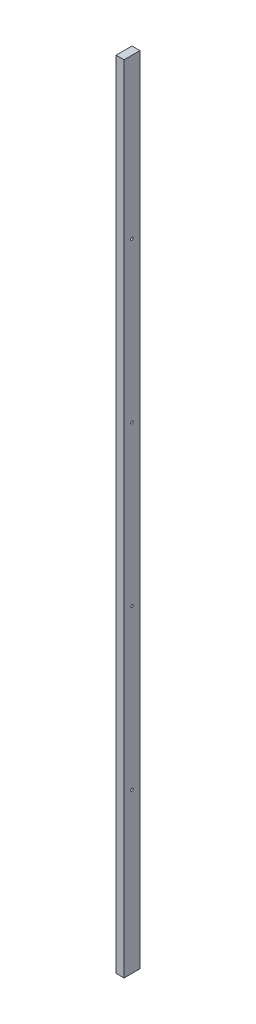
ISO-10303-21;
HEADER;
FILE_DESCRIPTION(('STEP AP214'),'2;1');
FILE_NAME('part.step','',(''),(''),'','','');
FILE_SCHEMA(('AUTOMOTIVE_DESIGN { 1 0 10303 214 1 1 1 1 }'));
ENDSEC;
DATA;
#1=APPLICATION_CONTEXT('core data for automotive mechanical design processes');
#2=APPLICATION_PROTOCOL_DEFINITION('international standard','automotive_design',2000,#1);
#3=PRODUCT_CONTEXT('',#1,'mechanical');
#4=PRODUCT('Part','Part','',(#3));
#5=PRODUCT_RELATED_PRODUCT_CATEGORY('part','',(#4));
#6=PRODUCT_DEFINITION_FORMATION('','',#4);
#7=PRODUCT_DEFINITION_CONTEXT('part definition',#1,'design');
#8=PRODUCT_DEFINITION('design','',#6,#7);
#9=PRODUCT_DEFINITION_SHAPE('','',#8);
#10=(LENGTH_UNIT() NAMED_UNIT(*) SI_UNIT(.MILLI.,.METRE.));
#11=(NAMED_UNIT(*) PLANE_ANGLE_UNIT() SI_UNIT($,.RADIAN.));
#12=(NAMED_UNIT(*) SI_UNIT($,.STERADIAN.) SOLID_ANGLE_UNIT());
#13=UNCERTAINTY_MEASURE_WITH_UNIT(LENGTH_MEASURE(1.E-05),#10,'distance_accuracy_value','');
#14=(GEOMETRIC_REPRESENTATION_CONTEXT(3) GLOBAL_UNCERTAINTY_ASSIGNED_CONTEXT((#13)) GLOBAL_UNIT_ASSIGNED_CONTEXT((#10,
#11,#12)) REPRESENTATION_CONTEXT('',''));
#15=CARTESIAN_POINT('',(0.,0.,0.));
#16=DIRECTION('',(0.,0.,1.));
#17=DIRECTION('',(1.,0.,0.));
#18=AXIS2_PLACEMENT_3D('',#15,#16,#17);
#19=CARTESIAN_POINT('',(-12.5,2500.,-25.));
#20=DIRECTION('',(1.,0.,0.));
#21=DIRECTION('',(0.,0.,-1.));
#22=AXIS2_PLACEMENT_3D('',#19,#20,#21);
#23=PLANE('',#22);
#24=CARTESIAN_POINT('',(-12.5,500.,0.));
#25=DIRECTION('',(1.,0.,0.));
#26=DIRECTION('',(0.,0.,-1.));
#27=AXIS2_PLACEMENT_3D('',#24,#25,#26);
#28=CIRCLE('',#27,4.);
#29=CARTESIAN_POINT('',(-12.5,500.,-4.));
#30=VERTEX_POINT('',#29);
#31=EDGE_CURVE('E115',#30,#30,#28,.T.);
#32=ORIENTED_EDGE('',*,*,#31,.T.);
#33=EDGE_LOOP('',(#32));
#34=FACE_BOUND('',#33,.T.);
#35=CARTESIAN_POINT('',(-12.5,1000.,0.));
#36=DIRECTION('',(1.,0.,0.));
#37=DIRECTION('',(0.,0.,-1.));
#38=AXIS2_PLACEMENT_3D('',#35,#36,#37);
#39=CIRCLE('',#38,4.);
#40=CARTESIAN_POINT('',(-12.5,1000.,-4.));
#41=VERTEX_POINT('',#40);
#42=EDGE_CURVE('E135',#41,#41,#39,.T.);
#43=ORIENTED_EDGE('',*,*,#42,.T.);
#44=EDGE_LOOP('',(#43));
#45=FACE_BOUND('',#44,.T.);
#46=CARTESIAN_POINT('',(-12.5,1500.,0.));
#47=DIRECTION('',(1.,0.,0.));
#48=DIRECTION('',(0.,0.,-1.));
#49=AXIS2_PLACEMENT_3D('',#46,#47,#48);
#50=CIRCLE('',#49,4.);
#51=CARTESIAN_POINT('',(-12.5,1500.,-4.));
#52=VERTEX_POINT('',#51);
#53=EDGE_CURVE('E139',#52,#52,#50,.T.);
#54=ORIENTED_EDGE('',*,*,#53,.T.);
#55=EDGE_LOOP('',(#54));
#56=FACE_BOUND('',#55,.T.);
#57=CARTESIAN_POINT('',(-12.5,2000.,0.));
#58=DIRECTION('',(1.,0.,0.));
#59=DIRECTION('',(0.,0.,-1.));
#60=AXIS2_PLACEMENT_3D('',#57,#58,#59);
#61=CIRCLE('',#60,4.);
#62=CARTESIAN_POINT('',(-12.5,2000.,-4.));
#63=VERTEX_POINT('',#62);
#64=EDGE_CURVE('E143',#63,#63,#61,.T.);
#65=ORIENTED_EDGE('',*,*,#64,.T.);
#66=EDGE_LOOP('',(#65));
#67=FACE_BOUND('',#66,.T.);
#68=DIRECTION('',(0.,0.,1.));
#69=VECTOR('',#68,1.);
#70=CARTESIAN_POINT('',(-12.5,0.,-25.));
#71=LINE('',#70,#69);
#72=CARTESIAN_POINT('',(-12.5,0.,-25.));
#73=VERTEX_POINT('',#72);
#74=CARTESIAN_POINT('',(-12.5,0.,25.));
#75=VERTEX_POINT('',#74);
#76=EDGE_CURVE('E111',#73,#75,#71,.T.);
#77=ORIENTED_EDGE('',*,*,#76,.T.);
#78=DIRECTION('',(0.,-1.,0.));
#79=VECTOR('',#78,1.);
#80=CARTESIAN_POINT('',(-12.5,2500.,25.));
#81=LINE('',#80,#79);
#82=CARTESIAN_POINT('',(-12.5,2500.,25.));
#83=VERTEX_POINT('',#82);
#84=EDGE_CURVE('E11',#83,#75,#81,.T.);
#85=ORIENTED_EDGE('',*,*,#84,.F.);
#86=DIRECTION('',(0.,0.,1.));
#87=VECTOR('',#86,1.);
#88=CARTESIAN_POINT('',(-12.5,2500.,-25.));
#89=LINE('',#88,#87);
#90=CARTESIAN_POINT('',(-12.5,2500.,-25.));
#91=VERTEX_POINT('',#90);
#92=EDGE_CURVE('E95',#91,#83,#89,.T.);
#93=ORIENTED_EDGE('',*,*,#92,.F.);
#94=DIRECTION('',(0.,-1.,0.));
#95=VECTOR('',#94,1.);
#96=CARTESIAN_POINT('',(-12.5,2500.,-25.));
#97=LINE('',#96,#95);
#98=EDGE_CURVE('E107',#91,#73,#97,.T.);
#99=ORIENTED_EDGE('',*,*,#98,.T.);
#100=EDGE_LOOP('',(#77,#85,#93,#99));
#101=FACE_BOUND('',#100,.T.);
#102=ADVANCED_FACE('F43',(#34,#45,#56,#67,#101),#23,.F.);
#103=CARTESIAN_POINT('',(12.5,2500.,25.));
#104=DIRECTION('',(0.,0.,-1.));
#105=DIRECTION('',(-1.,0.,0.));
#106=AXIS2_PLACEMENT_3D('',#103,#104,#105);
#107=PLANE('',#106);
#108=DIRECTION('',(1.,0.,0.));
#109=VECTOR('',#108,1.);
#110=CARTESIAN_POINT('',(12.5,0.,25.));
#111=LINE('',#110,#109);
#112=CARTESIAN_POINT('',(12.5,0.,25.));
#113=VERTEX_POINT('',#112);
#114=EDGE_CURVE('E100',#75,#113,#111,.T.);
#115=ORIENTED_EDGE('',*,*,#114,.T.);
#116=DIRECTION('',(0.,-1.,0.));
#117=VECTOR('',#116,1.);
#118=CARTESIAN_POINT('',(12.5,2500.,25.));
#119=LINE('',#118,#117);
#120=CARTESIAN_POINT('',(12.5,2500.,25.));
#121=VERTEX_POINT('',#120);
#122=EDGE_CURVE('E52',#121,#113,#119,.T.);
#123=ORIENTED_EDGE('',*,*,#122,.F.);
#124=DIRECTION('',(1.,0.,0.));
#125=VECTOR('',#124,1.);
#126=CARTESIAN_POINT('',(12.5,2500.,25.));
#127=LINE('',#126,#125);
#128=EDGE_CURVE('E90',#83,#121,#127,.T.);
#129=ORIENTED_EDGE('',*,*,#128,.F.);
#130=ORIENTED_EDGE('',*,*,#84,.T.);
#131=EDGE_LOOP('',(#115,#123,#129,#130));
#132=FACE_BOUND('',#131,.T.);
#133=ADVANCED_FACE('F99',(#132),#107,.F.);
#134=CARTESIAN_POINT('',(12.5,2500.,-25.));
#135=DIRECTION('',(-1.,0.,0.));
#136=DIRECTION('',(0.,0.,1.));
#137=AXIS2_PLACEMENT_3D('',#134,#135,#136);
#138=PLANE('',#137);
#139=CARTESIAN_POINT('',(12.5,500.,0.));
#140=DIRECTION('',(1.,0.,0.));
#141=DIRECTION('',(0.,0.,-1.));
#142=AXIS2_PLACEMENT_3D('',#139,#140,#141);
#143=CIRCLE('',#142,4.);
#144=CARTESIAN_POINT('',(12.5,500.,-4.));
#145=VERTEX_POINT('',#144);
#146=EDGE_CURVE('E147',#145,#145,#143,.T.);
#147=ORIENTED_EDGE('',*,*,#146,.F.);
#148=EDGE_LOOP('',(#147));
#149=FACE_BOUND('',#148,.T.);
#150=CARTESIAN_POINT('',(12.5,1000.,0.));
#151=DIRECTION('',(1.,0.,0.));
#152=DIRECTION('',(0.,0.,-1.));
#153=AXIS2_PLACEMENT_3D('',#150,#151,#152);
#154=CIRCLE('',#153,4.);
#155=CARTESIAN_POINT('',(12.5,1000.,-4.));
#156=VERTEX_POINT('',#155);
#157=EDGE_CURVE('E156',#156,#156,#154,.T.);
#158=ORIENTED_EDGE('',*,*,#157,.F.);
#159=EDGE_LOOP('',(#158));
#160=FACE_BOUND('',#159,.T.);
#161=CARTESIAN_POINT('',(12.5,1500.,0.));
#162=DIRECTION('',(1.,0.,0.));
#163=DIRECTION('',(0.,0.,-1.));
#164=AXIS2_PLACEMENT_3D('',#161,#162,#163);
#165=CIRCLE('',#164,4.);
#166=CARTESIAN_POINT('',(12.5,1500.,-4.));
#167=VERTEX_POINT('',#166);
#168=EDGE_CURVE('E152',#167,#167,#165,.T.);
#169=ORIENTED_EDGE('',*,*,#168,.F.);
#170=EDGE_LOOP('',(#169));
#171=FACE_BOUND('',#170,.T.);
#172=CARTESIAN_POINT('',(12.5,2000.,0.));
#173=DIRECTION('',(1.,0.,0.));
#174=DIRECTION('',(0.,0.,-1.));
#175=AXIS2_PLACEMENT_3D('',#172,#173,#174);
#176=CIRCLE('',#175,4.);
#177=CARTESIAN_POINT('',(12.5,2000.,-4.));
#178=VERTEX_POINT('',#177);
#179=EDGE_CURVE('E148',#178,#178,#176,.T.);
#180=ORIENTED_EDGE('',*,*,#179,.F.);
#181=EDGE_LOOP('',(#180));
#182=FACE_BOUND('',#181,.T.);
#183=DIRECTION('',(0.,0.,-1.));
#184=VECTOR('',#183,1.);
#185=CARTESIAN_POINT('',(12.5,0.,-25.));
#186=LINE('',#185,#184);
#187=CARTESIAN_POINT('',(12.5,0.,-25.));
#188=VERTEX_POINT('',#187);
#189=EDGE_CURVE('E77',#113,#188,#186,.T.);
#190=ORIENTED_EDGE('',*,*,#189,.T.);
#191=DIRECTION('',(0.,-1.,0.));
#192=VECTOR('',#191,1.);
#193=CARTESIAN_POINT('',(12.5,2500.,-25.));
#194=LINE('',#193,#192);
#195=CARTESIAN_POINT('',(12.5,2500.,-25.));
#196=VERTEX_POINT('',#195);
#197=EDGE_CURVE('E102',#196,#188,#194,.T.);
#198=ORIENTED_EDGE('',*,*,#197,.F.);
#199=DIRECTION('',(0.,0.,-1.));
#200=VECTOR('',#199,1.);
#201=CARTESIAN_POINT('',(12.5,2500.,-25.));
#202=LINE('',#201,#200);
#203=EDGE_CURVE('E93',#121,#196,#202,.T.);
#204=ORIENTED_EDGE('',*,*,#203,.F.);
#205=ORIENTED_EDGE('',*,*,#122,.T.);
#206=EDGE_LOOP('',(#190,#198,#204,#205));
#207=FACE_BOUND('',#206,.T.);
#208=ADVANCED_FACE('F103',(#149,#160,#171,#182,#207),#138,.F.);
#209=CARTESIAN_POINT('',(12.5,2500.,-25.));
#210=DIRECTION('',(0.,0.,1.));
#211=DIRECTION('',(1.,0.,0.));
#212=AXIS2_PLACEMENT_3D('',#209,#210,#211);
#213=PLANE('',#212);
#214=DIRECTION('',(-1.,0.,0.));
#215=VECTOR('',#214,1.);
#216=CARTESIAN_POINT('',(12.5,0.,-25.));
#217=LINE('',#216,#215);
#218=EDGE_CURVE('E83',#188,#73,#217,.T.);
#219=ORIENTED_EDGE('',*,*,#218,.T.);
#220=ORIENTED_EDGE('',*,*,#98,.F.);
#221=DIRECTION('',(-1.,0.,0.));
#222=VECTOR('',#221,1.);
#223=CARTESIAN_POINT('',(12.5,2500.,-25.));
#224=LINE('',#223,#222);
#225=EDGE_CURVE('E60',#196,#91,#224,.T.);
#226=ORIENTED_EDGE('',*,*,#225,.F.);
#227=ORIENTED_EDGE('',*,*,#197,.T.);
#228=EDGE_LOOP('',(#219,#220,#226,#227));
#229=FACE_BOUND('',#228,.T.);
#230=ADVANCED_FACE('F125',(#229),#213,.F.);
#231=CARTESIAN_POINT('',(0.,2500.,0.));
#232=DIRECTION('',(0.,-1.,0.));
#233=DIRECTION('',(0.,0.,-1.));
#234=AXIS2_PLACEMENT_3D('',#231,#232,#233);
#235=PLANE('',#234);
#236=ORIENTED_EDGE('',*,*,#92,.T.);
#237=ORIENTED_EDGE('',*,*,#128,.T.);
#238=ORIENTED_EDGE('',*,*,#203,.T.);
#239=ORIENTED_EDGE('',*,*,#225,.T.);
#240=EDGE_LOOP('',(#236,#237,#238,#239));
#241=FACE_BOUND('',#240,.T.);
#242=ADVANCED_FACE('F91',(#241),#235,.F.);
#243=CARTESIAN_POINT('',(0.,0.,0.));
#244=DIRECTION('',(0.,-1.,0.));
#245=DIRECTION('',(0.,0.,-1.));
#246=AXIS2_PLACEMENT_3D('',#243,#244,#245);
#247=PLANE('',#246);
#248=ORIENTED_EDGE('',*,*,#76,.F.);
#249=ORIENTED_EDGE('',*,*,#218,.F.);
#250=ORIENTED_EDGE('',*,*,#189,.F.);
#251=ORIENTED_EDGE('',*,*,#114,.F.);
#252=EDGE_LOOP('',(#248,#249,#250,#251));
#253=FACE_BOUND('',#252,.T.);
#254=ADVANCED_FACE('F128',(#253),#247,.T.);
#255=CARTESIAN_POINT('',(-87.5,2000.,0.));
#256=DIRECTION('',(1.,0.,0.));
#257=DIRECTION('',(0.,0.,-1.));
#258=AXIS2_PLACEMENT_3D('',#255,#256,#257);
#259=CYLINDRICAL_SURFACE('',#258,4.);
#260=ORIENTED_EDGE('',*,*,#179,.T.);
#261=EDGE_LOOP('',(#260));
#262=FACE_BOUND('',#261,.T.);
#263=ORIENTED_EDGE('',*,*,#64,.F.);
#264=EDGE_LOOP('',(#263));
#265=FACE_BOUND('',#264,.T.);
#266=ADVANCED_FACE('F176',(#262,#265),#259,.F.);
#267=CARTESIAN_POINT('',(-87.5,1500.,0.));
#268=DIRECTION('',(1.,0.,0.));
#269=DIRECTION('',(0.,0.,-1.));
#270=AXIS2_PLACEMENT_3D('',#267,#268,#269);
#271=CYLINDRICAL_SURFACE('',#270,4.);
#272=ORIENTED_EDGE('',*,*,#168,.T.);
#273=EDGE_LOOP('',(#272));
#274=FACE_BOUND('',#273,.T.);
#275=ORIENTED_EDGE('',*,*,#53,.F.);
#276=EDGE_LOOP('',(#275));
#277=FACE_BOUND('',#276,.T.);
#278=ADVANCED_FACE('F179',(#274,#277),#271,.F.);
#279=CARTESIAN_POINT('',(-87.5,1000.,0.));
#280=DIRECTION('',(1.,0.,0.));
#281=DIRECTION('',(0.,0.,-1.));
#282=AXIS2_PLACEMENT_3D('',#279,#280,#281);
#283=CYLINDRICAL_SURFACE('',#282,4.);
#284=ORIENTED_EDGE('',*,*,#157,.T.);
#285=EDGE_LOOP('',(#284));
#286=FACE_BOUND('',#285,.T.);
#287=ORIENTED_EDGE('',*,*,#42,.F.);
#288=EDGE_LOOP('',(#287));
#289=FACE_BOUND('',#288,.T.);
#290=ADVANCED_FACE('F195',(#286,#289),#283,.F.);
#291=CARTESIAN_POINT('',(-87.5,500.,0.));
#292=DIRECTION('',(1.,0.,0.));
#293=DIRECTION('',(0.,0.,-1.));
#294=AXIS2_PLACEMENT_3D('',#291,#292,#293);
#295=CYLINDRICAL_SURFACE('',#294,4.);
#296=ORIENTED_EDGE('',*,*,#146,.T.);
#297=EDGE_LOOP('',(#296));
#298=FACE_BOUND('',#297,.T.);
#299=ORIENTED_EDGE('',*,*,#31,.F.);
#300=EDGE_LOOP('',(#299));
#301=FACE_BOUND('',#300,.T.);
#302=ADVANCED_FACE('F164',(#298,#301),#295,.F.);
#303=CLOSED_SHELL('',(#102,#133,#208,#230,#242,#254,#266,#278,#290,#302));
#304=MANIFOLD_SOLID_BREP('B2',#303);
#305=ADVANCED_BREP_SHAPE_REPRESENTATION('',(#18,#304),#14);
#306=SHAPE_DEFINITION_REPRESENTATION(#9,#305);
ENDSEC;
END-ISO-10303-21;
